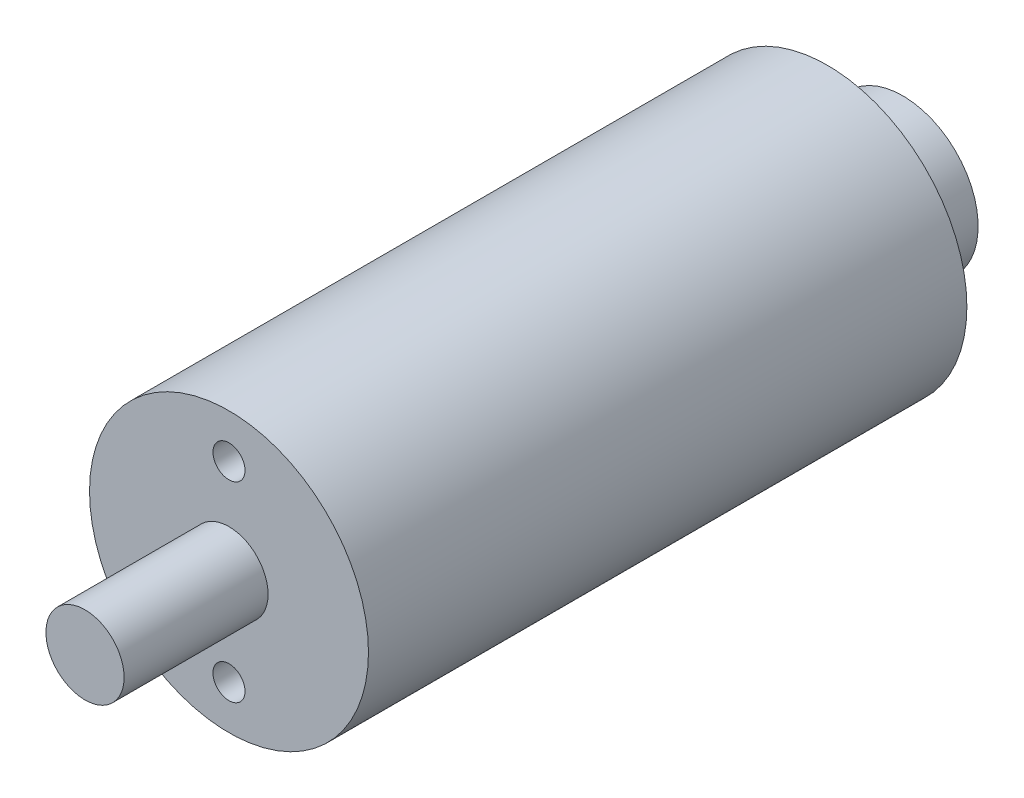
ISO-10303-21;
HEADER;
FILE_DESCRIPTION(('STEP AP214'),'2;1');
FILE_NAME('part.step','',(''),(''),'','','');
FILE_SCHEMA(('AUTOMOTIVE_DESIGN { 1 0 10303 214 1 1 1 1 }'));
ENDSEC;
DATA;
#1=APPLICATION_CONTEXT('core data for automotive mechanical design processes');
#2=APPLICATION_PROTOCOL_DEFINITION('international standard','automotive_design',2000,#1);
#3=PRODUCT_CONTEXT('',#1,'mechanical');
#4=PRODUCT('Part','Part','',(#3));
#5=PRODUCT_RELATED_PRODUCT_CATEGORY('part','',(#4));
#6=PRODUCT_DEFINITION_FORMATION('','',#4);
#7=PRODUCT_DEFINITION_CONTEXT('part definition',#1,'design');
#8=PRODUCT_DEFINITION('design','',#6,#7);
#9=PRODUCT_DEFINITION_SHAPE('','',#8);
#10=(LENGTH_UNIT() NAMED_UNIT(*) SI_UNIT(.MILLI.,.METRE.));
#11=(NAMED_UNIT(*) PLANE_ANGLE_UNIT() SI_UNIT($,.RADIAN.));
#12=(NAMED_UNIT(*) SI_UNIT($,.STERADIAN.) SOLID_ANGLE_UNIT());
#13=UNCERTAINTY_MEASURE_WITH_UNIT(LENGTH_MEASURE(1.E-05),#10,'distance_accuracy_value','');
#14=(GEOMETRIC_REPRESENTATION_CONTEXT(3) GLOBAL_UNCERTAINTY_ASSIGNED_CONTEXT((#13)) GLOBAL_UNIT_ASSIGNED_CONTEXT((#10,
#11,#12)) REPRESENTATION_CONTEXT('',''));
#15=CARTESIAN_POINT('',(0.,0.,0.));
#16=DIRECTION('',(0.,0.,1.));
#17=DIRECTION('',(1.,0.,0.));
#18=AXIS2_PLACEMENT_3D('',#15,#16,#17);
#19=CARTESIAN_POINT('',(0.,0.,-53.2));
#20=DIRECTION('',(0.,0.,1.));
#21=DIRECTION('',(1.,0.,0.));
#22=AXIS2_PLACEMENT_3D('',#19,#20,#21);
#23=CYLINDRICAL_SURFACE('',#22,12.4);
#24=CARTESIAN_POINT('',(0.,0.,-53.2));
#25=DIRECTION('',(0.,0.,1.));
#26=DIRECTION('',(1.,0.,0.));
#27=AXIS2_PLACEMENT_3D('',#24,#25,#26);
#28=CIRCLE('',#27,12.4);
#29=CARTESIAN_POINT('',(12.4,0.,-53.2));
#30=VERTEX_POINT('',#29);
#31=EDGE_CURVE('E47',#30,#30,#28,.T.);
#32=ORIENTED_EDGE('',*,*,#31,.T.);
#33=EDGE_LOOP('',(#32));
#34=FACE_BOUND('',#33,.T.);
#35=CARTESIAN_POINT('',(0.,0.,0.));
#36=DIRECTION('',(0.,0.,1.));
#37=DIRECTION('',(1.,0.,0.));
#38=AXIS2_PLACEMENT_3D('',#35,#36,#37);
#39=CIRCLE('',#38,12.4);
#40=CARTESIAN_POINT('',(12.4,0.,0.));
#41=VERTEX_POINT('',#40);
#42=EDGE_CURVE('E38',#41,#41,#39,.T.);
#43=ORIENTED_EDGE('',*,*,#42,.F.);
#44=EDGE_LOOP('',(#43));
#45=FACE_BOUND('',#44,.T.);
#46=ADVANCED_FACE('F35',(#34,#45),#23,.T.);
#47=CARTESIAN_POINT('',(0.,0.,-53.2));
#48=DIRECTION('',(0.,0.,1.));
#49=DIRECTION('',(1.,0.,0.));
#50=AXIS2_PLACEMENT_3D('',#47,#48,#49);
#51=PLANE('',#50);
#52=CARTESIAN_POINT('',(0.,0.,-53.2));
#53=DIRECTION('',(0.,0.,-1.));
#54=DIRECTION('',(-1.,0.,0.));
#55=AXIS2_PLACEMENT_3D('',#52,#53,#54);
#56=CIRCLE('',#55,6.7);
#57=CARTESIAN_POINT('',(-6.7,0.,-53.2));
#58=VERTEX_POINT('',#57);
#59=EDGE_CURVE('E10',#58,#58,#56,.T.);
#60=ORIENTED_EDGE('',*,*,#59,.F.);
#61=EDGE_LOOP('',(#60));
#62=FACE_BOUND('',#61,.T.);
#63=ORIENTED_EDGE('',*,*,#31,.F.);
#64=EDGE_LOOP('',(#63));
#65=FACE_BOUND('',#64,.T.);
#66=ADVANCED_FACE('F75',(#62,#65),#51,.F.);
#67=CARTESIAN_POINT('',(0.,0.,0.));
#68=DIRECTION('',(0.,0.,1.));
#69=DIRECTION('',(1.,0.,0.));
#70=AXIS2_PLACEMENT_3D('',#67,#68,#69);
#71=PLANE('',#70);
#72=CARTESIAN_POINT('',(0.,8.5,0.));
#73=DIRECTION('',(0.,0.,1.));
#74=DIRECTION('',(1.,0.,0.));
#75=AXIS2_PLACEMENT_3D('',#72,#73,#74);
#76=CIRCLE('',#75,1.425);
#77=CARTESIAN_POINT('',(1.425,8.5,0.));
#78=VERTEX_POINT('',#77);
#79=EDGE_CURVE('E56',#78,#78,#76,.T.);
#80=ORIENTED_EDGE('',*,*,#79,.F.);
#81=EDGE_LOOP('',(#80));
#82=FACE_BOUND('',#81,.T.);
#83=CARTESIAN_POINT('',(0.,-8.5,0.));
#84=DIRECTION('',(0.,0.,1.));
#85=DIRECTION('',(1.,0.,0.));
#86=AXIS2_PLACEMENT_3D('',#83,#84,#85);
#87=CIRCLE('',#86,1.425);
#88=CARTESIAN_POINT('',(1.425,-8.5,0.));
#89=VERTEX_POINT('',#88);
#90=EDGE_CURVE('E62',#89,#89,#87,.T.);
#91=ORIENTED_EDGE('',*,*,#90,.F.);
#92=EDGE_LOOP('',(#91));
#93=FACE_BOUND('',#92,.T.);
#94=CARTESIAN_POINT('',(0.,0.,0.));
#95=DIRECTION('',(0.,0.,1.));
#96=DIRECTION('',(1.,0.,0.));
#97=AXIS2_PLACEMENT_3D('',#94,#95,#96);
#98=CIRCLE('',#97,3.475);
#99=CARTESIAN_POINT('',(3.475,0.,0.));
#100=VERTEX_POINT('',#99);
#101=EDGE_CURVE('E42',#100,#100,#98,.T.);
#102=ORIENTED_EDGE('',*,*,#101,.F.);
#103=EDGE_LOOP('',(#102));
#104=FACE_BOUND('',#103,.T.);
#105=ORIENTED_EDGE('',*,*,#42,.T.);
#106=EDGE_LOOP('',(#105));
#107=FACE_BOUND('',#106,.T.);
#108=ADVANCED_FACE('F72',(#82,#93,#104,#107),#71,.T.);
#109=CARTESIAN_POINT('',(0.,0.,12.8));
#110=DIRECTION('',(0.,0.,-1.));
#111=DIRECTION('',(-1.,0.,0.));
#112=AXIS2_PLACEMENT_3D('',#109,#110,#111);
#113=CYLINDRICAL_SURFACE('',#112,3.475);
#114=CARTESIAN_POINT('',(0.,0.,12.8));
#115=DIRECTION('',(0.,0.,1.));
#116=DIRECTION('',(1.,0.,0.));
#117=AXIS2_PLACEMENT_3D('',#114,#115,#116);
#118=CIRCLE('',#117,3.475);
#119=CARTESIAN_POINT('',(3.475,0.,12.8));
#120=VERTEX_POINT('',#119);
#121=EDGE_CURVE('E55',#120,#120,#118,.T.);
#122=ORIENTED_EDGE('',*,*,#121,.F.);
#123=EDGE_LOOP('',(#122));
#124=FACE_BOUND('',#123,.T.);
#125=ORIENTED_EDGE('',*,*,#101,.T.);
#126=EDGE_LOOP('',(#125));
#127=FACE_BOUND('',#126,.T.);
#128=ADVANCED_FACE('F84',(#124,#127),#113,.T.);
#129=CARTESIAN_POINT('',(0.,0.,12.8));
#130=DIRECTION('',(0.,0.,1.));
#131=DIRECTION('',(1.,0.,0.));
#132=AXIS2_PLACEMENT_3D('',#129,#130,#131);
#133=PLANE('',#132);
#134=ORIENTED_EDGE('',*,*,#121,.T.);
#135=EDGE_LOOP('',(#134));
#136=FACE_BOUND('',#135,.T.);
#137=ADVANCED_FACE('F90',(#136),#133,.T.);
#138=CARTESIAN_POINT('',(0.,-8.5,-5.));
#139=DIRECTION('',(0.,0.,1.));
#140=DIRECTION('',(1.,0.,0.));
#141=AXIS2_PLACEMENT_3D('',#138,#139,#140);
#142=CYLINDRICAL_SURFACE('',#141,1.425);
#143=CARTESIAN_POINT('',(0.,-8.5,-5.));
#144=DIRECTION('',(0.,0.,1.));
#145=DIRECTION('',(1.,0.,0.));
#146=AXIS2_PLACEMENT_3D('',#143,#144,#145);
#147=CIRCLE('',#146,1.425);
#148=CARTESIAN_POINT('',(1.425,-8.5,-5.));
#149=VERTEX_POINT('',#148);
#150=EDGE_CURVE('E59',#149,#149,#147,.T.);
#151=ORIENTED_EDGE('',*,*,#150,.F.);
#152=EDGE_LOOP('',(#151));
#153=FACE_BOUND('',#152,.T.);
#154=ORIENTED_EDGE('',*,*,#90,.T.);
#155=EDGE_LOOP('',(#154));
#156=FACE_BOUND('',#155,.T.);
#157=ADVANCED_FACE('F94',(#153,#156),#142,.F.);
#158=CARTESIAN_POINT('',(0.,-8.5,-5.));
#159=DIRECTION('',(0.,0.,1.));
#160=DIRECTION('',(1.,0.,0.));
#161=AXIS2_PLACEMENT_3D('',#158,#159,#160);
#162=PLANE('',#161);
#163=ORIENTED_EDGE('',*,*,#150,.T.);
#164=EDGE_LOOP('',(#163));
#165=FACE_BOUND('',#164,.T.);
#166=ADVANCED_FACE('F98',(#165),#162,.T.);
#167=CARTESIAN_POINT('',(0.,8.5,-5.));
#168=DIRECTION('',(0.,0.,1.));
#169=DIRECTION('',(1.,0.,0.));
#170=AXIS2_PLACEMENT_3D('',#167,#168,#169);
#171=CYLINDRICAL_SURFACE('',#170,1.425);
#172=CARTESIAN_POINT('',(0.,8.5,-5.));
#173=DIRECTION('',(0.,0.,1.));
#174=DIRECTION('',(1.,0.,0.));
#175=AXIS2_PLACEMENT_3D('',#172,#173,#174);
#176=CIRCLE('',#175,1.425);
#177=CARTESIAN_POINT('',(1.425,8.5,-5.));
#178=VERTEX_POINT('',#177);
#179=EDGE_CURVE('E52',#178,#178,#176,.T.);
#180=ORIENTED_EDGE('',*,*,#179,.F.);
#181=EDGE_LOOP('',(#180));
#182=FACE_BOUND('',#181,.T.);
#183=ORIENTED_EDGE('',*,*,#79,.T.);
#184=EDGE_LOOP('',(#183));
#185=FACE_BOUND('',#184,.T.);
#186=ADVANCED_FACE('F102',(#182,#185),#171,.F.);
#187=CARTESIAN_POINT('',(0.,8.5,-5.));
#188=DIRECTION('',(0.,0.,1.));
#189=DIRECTION('',(1.,0.,0.));
#190=AXIS2_PLACEMENT_3D('',#187,#188,#189);
#191=PLANE('',#190);
#192=ORIENTED_EDGE('',*,*,#179,.T.);
#193=EDGE_LOOP('',(#192));
#194=FACE_BOUND('',#193,.T.);
#195=ADVANCED_FACE('F106',(#194),#191,.T.);
#196=CARTESIAN_POINT('',(0.,0.,-59.9));
#197=DIRECTION('',(0.,0.,1.));
#198=DIRECTION('',(1.,0.,0.));
#199=AXIS2_PLACEMENT_3D('',#196,#197,#198);
#200=CYLINDRICAL_SURFACE('',#199,6.7);
#201=CARTESIAN_POINT('',(0.,0.,-59.9));
#202=DIRECTION('',(0.,0.,-1.));
#203=DIRECTION('',(-1.,0.,0.));
#204=AXIS2_PLACEMENT_3D('',#201,#202,#203);
#205=CIRCLE('',#204,6.7);
#206=CARTESIAN_POINT('',(-6.7,0.,-59.9));
#207=VERTEX_POINT('',#206);
#208=EDGE_CURVE('E51',#207,#207,#205,.T.);
#209=ORIENTED_EDGE('',*,*,#208,.F.);
#210=EDGE_LOOP('',(#209));
#211=FACE_BOUND('',#210,.T.);
#212=ORIENTED_EDGE('',*,*,#59,.T.);
#213=EDGE_LOOP('',(#212));
#214=FACE_BOUND('',#213,.T.);
#215=ADVANCED_FACE('F110',(#211,#214),#200,.T.);
#216=CARTESIAN_POINT('',(0.,0.,-59.9));
#217=DIRECTION('',(0.,0.,-1.));
#218=DIRECTION('',(-1.,0.,0.));
#219=AXIS2_PLACEMENT_3D('',#216,#217,#218);
#220=PLANE('',#219);
#221=ORIENTED_EDGE('',*,*,#208,.T.);
#222=EDGE_LOOP('',(#221));
#223=FACE_BOUND('',#222,.T.);
#224=ADVANCED_FACE('F114',(#223),#220,.T.);
#225=CLOSED_SHELL('',(#46,#66,#108,#128,#137,#157,#166,#186,#195,#215,#224));
#226=MANIFOLD_SOLID_BREP('B2',#225);
#227=ADVANCED_BREP_SHAPE_REPRESENTATION('',(#18,#226),#14);
#228=SHAPE_DEFINITION_REPRESENTATION(#9,#227);
ENDSEC;
END-ISO-10303-21;
